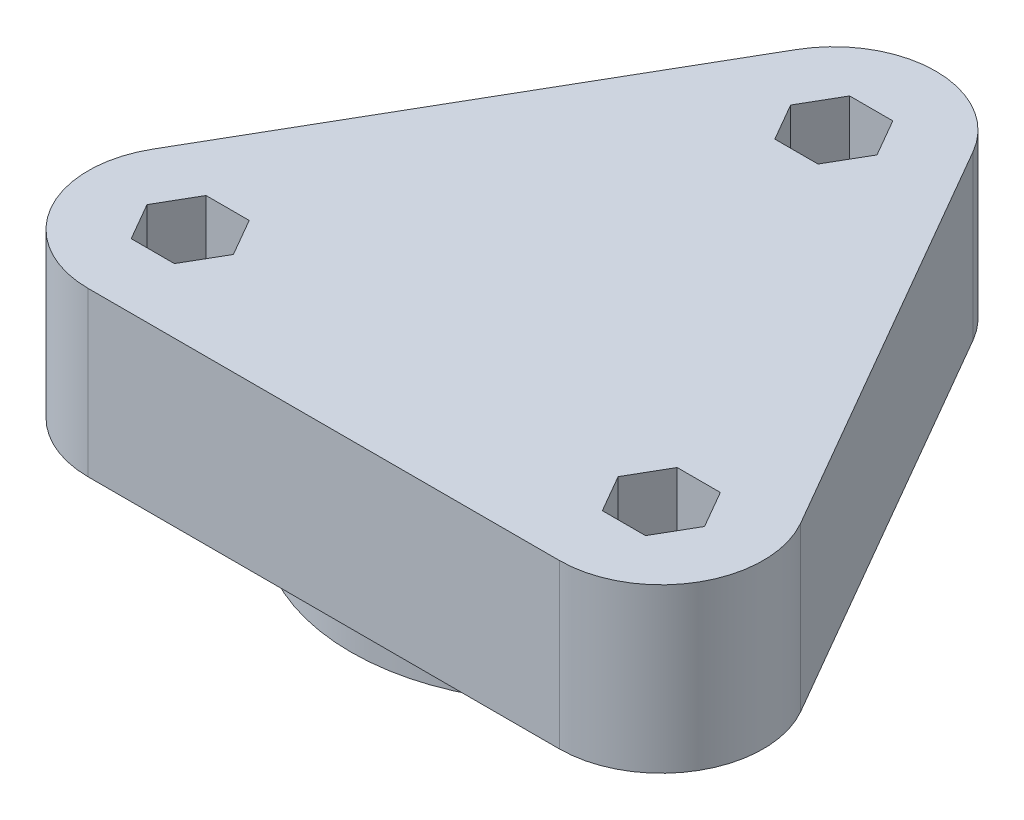
ISO-10303-21;
HEADER;
FILE_DESCRIPTION(('STEP AP214'),'2;1');
FILE_NAME('part.step','',(''),(''),'','','');
FILE_SCHEMA(('AUTOMOTIVE_DESIGN { 1 0 10303 214 1 1 1 1 }'));
ENDSEC;
DATA;
#1=APPLICATION_CONTEXT('core data for automotive mechanical design processes');
#2=APPLICATION_PROTOCOL_DEFINITION('international standard','automotive_design',2000,#1);
#3=PRODUCT_CONTEXT('',#1,'mechanical');
#4=PRODUCT('Part','Part','',(#3));
#5=PRODUCT_RELATED_PRODUCT_CATEGORY('part','',(#4));
#6=PRODUCT_DEFINITION_FORMATION('','',#4);
#7=PRODUCT_DEFINITION_CONTEXT('part definition',#1,'design');
#8=PRODUCT_DEFINITION('design','',#6,#7);
#9=PRODUCT_DEFINITION_SHAPE('','',#8);
#10=(LENGTH_UNIT() NAMED_UNIT(*) SI_UNIT(.MILLI.,.METRE.));
#11=(NAMED_UNIT(*) PLANE_ANGLE_UNIT() SI_UNIT($,.RADIAN.));
#12=(NAMED_UNIT(*) SI_UNIT($,.STERADIAN.) SOLID_ANGLE_UNIT());
#13=UNCERTAINTY_MEASURE_WITH_UNIT(LENGTH_MEASURE(1.E-05),#10,'distance_accuracy_value','');
#14=(GEOMETRIC_REPRESENTATION_CONTEXT(3) GLOBAL_UNCERTAINTY_ASSIGNED_CONTEXT((#13)) GLOBAL_UNIT_ASSIGNED_CONTEXT((#10,
#11,#12)) REPRESENTATION_CONTEXT('',''));
#15=CARTESIAN_POINT('',(0.,0.,0.));
#16=DIRECTION('',(0.,0.,1.));
#17=DIRECTION('',(1.,0.,0.));
#18=AXIS2_PLACEMENT_3D('',#15,#16,#17);
#19=CARTESIAN_POINT('',(0.,0.,-20.));
#20=DIRECTION('',(0.,1.,0.));
#21=DIRECTION('',(0.,0.,1.));
#22=AXIS2_PLACEMENT_3D('',#19,#20,#21);
#23=PLANE('',#22);
#24=CARTESIAN_POINT('',(17.3205080756887,0.,10.0000000000001));
#25=DIRECTION('',(0.,1.,0.));
#26=DIRECTION('',(0.,0.,1.));
#27=AXIS2_PLACEMENT_3D('',#24,#25,#26);
#28=CIRCLE('',#27,1.6);
#29=CARTESIAN_POINT('',(17.3205080756887,0.,11.6000000000001));
#30=VERTEX_POINT('',#29);
#31=EDGE_CURVE('E347',#30,#30,#28,.T.);
#32=ORIENTED_EDGE('',*,*,#31,.T.);
#33=EDGE_LOOP('',(#32));
#34=FACE_BOUND('',#33,.T.);
#35=CARTESIAN_POINT('',(-17.3205080756887,0.,10.0000000000001));
#36=DIRECTION('',(0.,1.,0.));
#37=DIRECTION('',(0.,0.,1.));
#38=AXIS2_PLACEMENT_3D('',#35,#36,#37);
#39=CIRCLE('',#38,1.6);
#40=CARTESIAN_POINT('',(-17.3205080756887,0.,11.6000000000001));
#41=VERTEX_POINT('',#40);
#42=EDGE_CURVE('E350',#41,#41,#39,.T.);
#43=ORIENTED_EDGE('',*,*,#42,.T.);
#44=EDGE_LOOP('',(#43));
#45=FACE_BOUND('',#44,.T.);
#46=CARTESIAN_POINT('',(0.,0.,-20.));
#47=DIRECTION('',(0.,1.,0.));
#48=DIRECTION('',(0.,0.,1.));
#49=AXIS2_PLACEMENT_3D('',#46,#47,#48);
#50=CIRCLE('',#49,1.6);
#51=CARTESIAN_POINT('',(0.,0.,-18.4));
#52=VERTEX_POINT('',#51);
#53=EDGE_CURVE('E353',#52,#52,#50,.T.);
#54=ORIENTED_EDGE('',*,*,#53,.T.);
#55=EDGE_LOOP('',(#54));
#56=FACE_BOUND('',#55,.T.);
#57=CARTESIAN_POINT('',(0.,0.,-20.));
#58=DIRECTION('',(0.,1.,0.));
#59=DIRECTION('',(0.,0.,1.));
#60=AXIS2_PLACEMENT_3D('',#57,#58,#59);
#61=CIRCLE('',#60,7.49999999999992);
#62=CARTESIAN_POINT('',(6.49519052838323,0.,-23.7499999999999));
#63=VERTEX_POINT('',#62);
#64=CARTESIAN_POINT('',(-6.49519052838323,0.,-23.7499999999999));
#65=VERTEX_POINT('',#64);
#66=EDGE_CURVE('E356',#63,#65,#61,.T.);
#67=ORIENTED_EDGE('',*,*,#66,.F.);
#68=DIRECTION('',(-0.499999999999998,0.,-0.86602540378444));
#69=VECTOR('',#68,1.);
#70=CARTESIAN_POINT('',(6.49519052838323,0.,-23.7499999999999));
#71=LINE('',#70,#69);
#72=CARTESIAN_POINT('',(23.815698604072,0.,6.25000000000013));
#73=VERTEX_POINT('',#72);
#74=EDGE_CURVE('E361',#73,#63,#71,.T.);
#75=ORIENTED_EDGE('',*,*,#74,.F.);
#76=CARTESIAN_POINT('',(17.3205080756887,0.,10.0000000000001));
#77=DIRECTION('',(0.,1.,0.));
#78=DIRECTION('',(0.,0.,1.));
#79=AXIS2_PLACEMENT_3D('',#76,#77,#78);
#80=CIRCLE('',#79,7.49999999999993);
#81=CARTESIAN_POINT('',(17.3205080756887,0.,17.5));
#82=VERTEX_POINT('',#81);
#83=EDGE_CURVE('E380',#82,#73,#80,.T.);
#84=ORIENTED_EDGE('',*,*,#83,.F.);
#85=DIRECTION('',(1.,0.,0.));
#86=VECTOR('',#85,1.);
#87=CARTESIAN_POINT('',(-17.3205080756887,0.,17.5));
#88=LINE('',#87,#86);
#89=CARTESIAN_POINT('',(-17.3205080756887,0.,17.5));
#90=VERTEX_POINT('',#89);
#91=EDGE_CURVE('E378',#90,#82,#88,.T.);
#92=ORIENTED_EDGE('',*,*,#91,.F.);
#93=CARTESIAN_POINT('',(-17.3205080756887,0.,10.0000000000001));
#94=DIRECTION('',(0.,1.,0.));
#95=DIRECTION('',(0.,0.,1.));
#96=AXIS2_PLACEMENT_3D('',#93,#94,#95);
#97=CIRCLE('',#96,7.49999999999993);
#98=CARTESIAN_POINT('',(-23.815698604072,0.,6.25000000000013));
#99=VERTEX_POINT('',#98);
#100=EDGE_CURVE('E376',#99,#90,#97,.T.);
#101=ORIENTED_EDGE('',*,*,#100,.F.);
#102=DIRECTION('',(-0.499999999999998,0.,0.86602540378444));
#103=VECTOR('',#102,1.);
#104=CARTESIAN_POINT('',(-6.49519052838323,0.,-23.7499999999999));
#105=LINE('',#104,#103);
#106=EDGE_CURVE('E374',#65,#99,#105,.T.);
#107=ORIENTED_EDGE('',*,*,#106,.F.);
#108=EDGE_LOOP('',(#67,#75,#84,#92,#101,#107));
#109=FACE_BOUND('',#108,.T.);
#110=CARTESIAN_POINT('',(0.,0.,0.));
#111=DIRECTION('',(0.,1.,0.));
#112=DIRECTION('',(0.,0.,1.));
#113=AXIS2_PLACEMENT_3D('',#110,#111,#112);
#114=CIRCLE('',#113,15.5);
#115=CARTESIAN_POINT('',(0.,0.,15.5));
#116=VERTEX_POINT('',#115);
#117=EDGE_CURVE('E11',#116,#116,#114,.F.);
#118=ORIENTED_EDGE('',*,*,#117,.F.);
#119=EDGE_LOOP('',(#118));
#120=FACE_BOUND('',#119,.T.);
#121=ADVANCED_FACE('F32',(#34,#45,#56,#109,#120),#23,.F.);
#122=CARTESIAN_POINT('',(17.3205080756887,12.,10.0000000000001));
#123=DIRECTION('',(0.,-1.,0.));
#124=DIRECTION('',(0.,0.,-1.));
#125=AXIS2_PLACEMENT_3D('',#122,#123,#124);
#126=CYLINDRICAL_SURFACE('',#125,1.6);
#127=ORIENTED_EDGE('',*,*,#31,.F.);
#128=EDGE_LOOP('',(#127));
#129=FACE_BOUND('',#128,.T.);
#130=CARTESIAN_POINT('',(17.3205080756887,7.,10.0000000000001));
#131=DIRECTION('',(0.,1.,0.));
#132=DIRECTION('',(0.,0.,1.));
#133=AXIS2_PLACEMENT_3D('',#130,#131,#132);
#134=CIRCLE('',#133,1.6);
#135=CARTESIAN_POINT('',(17.3205080756887,7.,11.6000000000001));
#136=VERTEX_POINT('',#135);
#137=EDGE_CURVE('E243',#136,#136,#134,.T.);
#138=ORIENTED_EDGE('',*,*,#137,.T.);
#139=EDGE_LOOP('',(#138));
#140=FACE_BOUND('',#139,.T.);
#141=ADVANCED_FACE('F405',(#129,#140),#126,.F.);
#142=CARTESIAN_POINT('',(0.,12.,-20.));
#143=DIRECTION('',(0.,-1.,0.));
#144=DIRECTION('',(0.,0.,-1.));
#145=AXIS2_PLACEMENT_3D('',#142,#143,#144);
#146=CYLINDRICAL_SURFACE('',#145,1.6);
#147=ORIENTED_EDGE('',*,*,#53,.F.);
#148=EDGE_LOOP('',(#147));
#149=FACE_BOUND('',#148,.T.);
#150=CARTESIAN_POINT('',(0.,7.,-20.));
#151=DIRECTION('',(0.,1.,0.));
#152=DIRECTION('',(0.,0.,1.));
#153=AXIS2_PLACEMENT_3D('',#150,#151,#152);
#154=CIRCLE('',#153,1.6);
#155=CARTESIAN_POINT('',(0.,7.,-18.4));
#156=VERTEX_POINT('',#155);
#157=EDGE_CURVE('E288',#156,#156,#154,.T.);
#158=ORIENTED_EDGE('',*,*,#157,.T.);
#159=EDGE_LOOP('',(#158));
#160=FACE_BOUND('',#159,.T.);
#161=ADVANCED_FACE('F427',(#149,#160),#146,.F.);
#162=CARTESIAN_POINT('',(-17.3205080756887,12.,10.0000000000001));
#163=DIRECTION('',(0.,-1.,0.));
#164=DIRECTION('',(0.,0.,-1.));
#165=AXIS2_PLACEMENT_3D('',#162,#163,#164);
#166=CYLINDRICAL_SURFACE('',#165,1.6);
#167=ORIENTED_EDGE('',*,*,#42,.F.);
#168=EDGE_LOOP('',(#167));
#169=FACE_BOUND('',#168,.T.);
#170=CARTESIAN_POINT('',(-17.3205080756887,7.,10.0000000000001));
#171=DIRECTION('',(0.,1.,0.));
#172=DIRECTION('',(0.,0.,1.));
#173=AXIS2_PLACEMENT_3D('',#170,#171,#172);
#174=CIRCLE('',#173,1.6);
#175=CARTESIAN_POINT('',(-17.3205080756887,7.,11.6000000000001));
#176=VERTEX_POINT('',#175);
#177=EDGE_CURVE('E336',#176,#176,#174,.T.);
#178=ORIENTED_EDGE('',*,*,#177,.T.);
#179=EDGE_LOOP('',(#178));
#180=FACE_BOUND('',#179,.T.);
#181=ADVANCED_FACE('F478',(#169,#180),#166,.F.);
#182=CARTESIAN_POINT('',(0.,12.,-20.));
#183=DIRECTION('',(0.,1.,0.));
#184=DIRECTION('',(0.,0.,1.));
#185=AXIS2_PLACEMENT_3D('',#182,#183,#184);
#186=PLANE('',#185);
#187=DIRECTION('',(-0.500000000000001,0.,-0.866025403784438));
#188=VECTOR('',#187,1.);
#189=CARTESIAN_POINT('',(20.4959345562317,12.,10.0000000000001));
#190=LINE('',#189,#188);
#191=CARTESIAN_POINT('',(20.4959345562317,12.,10.0000000000001));
#192=VERTEX_POINT('',#191);
#193=CARTESIAN_POINT('',(18.9082213159602,12.,7.25000000000007));
#194=VERTEX_POINT('',#193);
#195=EDGE_CURVE('E47',#192,#194,#190,.T.);
#196=ORIENTED_EDGE('',*,*,#195,.F.);
#197=DIRECTION('',(0.5,0.,-0.866025403784439));
#198=VECTOR('',#197,1.);
#199=CARTESIAN_POINT('',(18.9082213159602,12.,12.7500000000001));
#200=LINE('',#199,#198);
#201=CARTESIAN_POINT('',(18.9082213159602,12.,12.7500000000001));
#202=VERTEX_POINT('',#201);
#203=EDGE_CURVE('E214',#202,#192,#200,.T.);
#204=ORIENTED_EDGE('',*,*,#203,.F.);
#205=DIRECTION('',(1.,0.,0.));
#206=VECTOR('',#205,1.);
#207=CARTESIAN_POINT('',(15.7327948354173,12.,12.7500000000001));
#208=LINE('',#207,#206);
#209=CARTESIAN_POINT('',(15.7327948354173,12.,12.7500000000001));
#210=VERTEX_POINT('',#209);
#211=EDGE_CURVE('E217',#210,#202,#208,.T.);
#212=ORIENTED_EDGE('',*,*,#211,.F.);
#213=DIRECTION('',(0.500000000000001,0.,0.866025403784438));
#214=VECTOR('',#213,1.);
#215=CARTESIAN_POINT('',(14.1450815951458,12.,10.0000000000001));
#216=LINE('',#215,#214);
#217=CARTESIAN_POINT('',(14.1450815951458,12.,10.0000000000001));
#218=VERTEX_POINT('',#217);
#219=EDGE_CURVE('E236',#218,#210,#216,.T.);
#220=ORIENTED_EDGE('',*,*,#219,.F.);
#221=DIRECTION('',(-0.500000000000001,0.,0.866025403784438));
#222=VECTOR('',#221,1.);
#223=CARTESIAN_POINT('',(15.7327948354173,12.,7.25000000000008));
#224=LINE('',#223,#222);
#225=CARTESIAN_POINT('',(15.7327948354173,12.,7.25000000000008));
#226=VERTEX_POINT('',#225);
#227=EDGE_CURVE('E233',#226,#218,#224,.T.);
#228=ORIENTED_EDGE('',*,*,#227,.F.);
#229=DIRECTION('',(-1.,0.,0.));
#230=VECTOR('',#229,1.);
#231=CARTESIAN_POINT('',(18.9082213159602,12.,7.25000000000008));
#232=LINE('',#231,#230);
#233=EDGE_CURVE('E231',#194,#226,#232,.T.);
#234=ORIENTED_EDGE('',*,*,#233,.F.);
#235=EDGE_LOOP('',(#196,#204,#212,#220,#228,#234));
#236=FACE_BOUND('',#235,.T.);
#237=DIRECTION('',(-1.,0.,0.));
#238=VECTOR('',#237,1.);
#239=CARTESIAN_POINT('',(1.58771324027147,12.,-22.75));
#240=LINE('',#239,#238);
#241=CARTESIAN_POINT('',(1.58771324027147,12.,-22.75));
#242=VERTEX_POINT('',#241);
#243=CARTESIAN_POINT('',(-1.58771324027147,12.,-22.75));
#244=VERTEX_POINT('',#243);
#245=EDGE_CURVE('E55',#242,#244,#240,.T.);
#246=ORIENTED_EDGE('',*,*,#245,.F.);
#247=DIRECTION('',(-0.5,0.,-0.866025403784439));
#248=VECTOR('',#247,1.);
#249=CARTESIAN_POINT('',(3.17542648054294,12.,-20.));
#250=LINE('',#249,#248);
#251=CARTESIAN_POINT('',(3.17542648054294,12.,-20.));
#252=VERTEX_POINT('',#251);
#253=EDGE_CURVE('E255',#252,#242,#250,.T.);
#254=ORIENTED_EDGE('',*,*,#253,.F.);
#255=DIRECTION('',(0.5,0.,-0.866025403784439));
#256=VECTOR('',#255,1.);
#257=CARTESIAN_POINT('',(1.58771324027147,12.,-17.25));
#258=LINE('',#257,#256);
#259=CARTESIAN_POINT('',(1.58771324027147,12.,-17.25));
#260=VERTEX_POINT('',#259);
#261=EDGE_CURVE('E281',#260,#252,#258,.T.);
#262=ORIENTED_EDGE('',*,*,#261,.F.);
#263=DIRECTION('',(1.,0.,0.));
#264=VECTOR('',#263,1.);
#265=CARTESIAN_POINT('',(-1.58771324027147,12.,-17.25));
#266=LINE('',#265,#264);
#267=CARTESIAN_POINT('',(-1.58771324027147,12.,-17.25));
#268=VERTEX_POINT('',#267);
#269=EDGE_CURVE('E278',#268,#260,#266,.T.);
#270=ORIENTED_EDGE('',*,*,#269,.F.);
#271=DIRECTION('',(0.5,0.,0.866025403784439));
#272=VECTOR('',#271,1.);
#273=CARTESIAN_POINT('',(-3.17542648054294,12.,-20.));
#274=LINE('',#273,#272);
#275=CARTESIAN_POINT('',(-3.17542648054294,12.,-20.));
#276=VERTEX_POINT('',#275);
#277=EDGE_CURVE('E275',#276,#268,#274,.T.);
#278=ORIENTED_EDGE('',*,*,#277,.F.);
#279=DIRECTION('',(-0.499999999999999,0.,0.866025403784439));
#280=VECTOR('',#279,1.);
#281=CARTESIAN_POINT('',(-1.58771324027147,12.,-22.75));
#282=LINE('',#281,#280);
#283=EDGE_CURVE('E272',#244,#276,#282,.T.);
#284=ORIENTED_EDGE('',*,*,#283,.F.);
#285=EDGE_LOOP('',(#246,#254,#262,#270,#278,#284));
#286=FACE_BOUND('',#285,.T.);
#287=DIRECTION('',(-1.,0.,0.));
#288=VECTOR('',#287,1.);
#289=CARTESIAN_POINT('',(-15.7327948354173,12.,7.25000000000008));
#290=LINE('',#289,#288);
#291=CARTESIAN_POINT('',(-15.7327948354173,12.,7.25000000000008));
#292=VERTEX_POINT('',#291);
#293=CARTESIAN_POINT('',(-18.9082213159602,12.,7.25000000000008));
#294=VERTEX_POINT('',#293);
#295=EDGE_CURVE('E318',#292,#294,#290,.T.);
#296=ORIENTED_EDGE('',*,*,#295,.F.);
#297=DIRECTION('',(-0.5,0.,-0.866025403784439));
#298=VECTOR('',#297,1.);
#299=CARTESIAN_POINT('',(-14.1450815951458,12.,10.0000000000001));
#300=LINE('',#299,#298);
#301=CARTESIAN_POINT('',(-14.1450815951458,12.,10.0000000000001));
#302=VERTEX_POINT('',#301);
#303=EDGE_CURVE('E302',#302,#292,#300,.T.);
#304=ORIENTED_EDGE('',*,*,#303,.F.);
#305=DIRECTION('',(0.5,0.,-0.866025403784439));
#306=VECTOR('',#305,1.);
#307=CARTESIAN_POINT('',(-15.7327948354173,12.,12.7500000000001));
#308=LINE('',#307,#306);
#309=CARTESIAN_POINT('',(-15.7327948354173,12.,12.7500000000001));
#310=VERTEX_POINT('',#309);
#311=EDGE_CURVE('E329',#310,#302,#308,.T.);
#312=ORIENTED_EDGE('',*,*,#311,.F.);
#313=DIRECTION('',(1.,0.,0.));
#314=VECTOR('',#313,1.);
#315=CARTESIAN_POINT('',(-18.9082213159602,12.,12.7500000000001));
#316=LINE('',#315,#314);
#317=CARTESIAN_POINT('',(-18.9082213159602,12.,12.7500000000001));
#318=VERTEX_POINT('',#317);
#319=EDGE_CURVE('E326',#318,#310,#316,.T.);
#320=ORIENTED_EDGE('',*,*,#319,.F.);
#321=DIRECTION('',(0.5,0.,0.866025403784439));
#322=VECTOR('',#321,1.);
#323=CARTESIAN_POINT('',(-20.4959345562317,12.,10.0000000000001));
#324=LINE('',#323,#322);
#325=CARTESIAN_POINT('',(-20.4959345562317,12.,10.0000000000001));
#326=VERTEX_POINT('',#325);
#327=EDGE_CURVE('E323',#326,#318,#324,.T.);
#328=ORIENTED_EDGE('',*,*,#327,.F.);
#329=DIRECTION('',(-0.5,0.,0.866025403784439));
#330=VECTOR('',#329,1.);
#331=CARTESIAN_POINT('',(-18.9082213159602,12.,7.25000000000008));
#332=LINE('',#331,#330);
#333=EDGE_CURVE('E320',#294,#326,#332,.T.);
#334=ORIENTED_EDGE('',*,*,#333,.F.);
#335=EDGE_LOOP('',(#296,#304,#312,#320,#328,#334));
#336=FACE_BOUND('',#335,.T.);
#337=CARTESIAN_POINT('',(0.,12.,-20.));
#338=DIRECTION('',(0.,1.,0.));
#339=DIRECTION('',(0.,0.,1.));
#340=AXIS2_PLACEMENT_3D('',#337,#338,#339);
#341=CIRCLE('',#340,7.49999999999992);
#342=CARTESIAN_POINT('',(6.49519052838323,12.,-23.7499999999999));
#343=VERTEX_POINT('',#342);
#344=CARTESIAN_POINT('',(-6.49519052838323,12.,-23.7499999999999));
#345=VERTEX_POINT('',#344);
#346=EDGE_CURVE('E357',#343,#345,#341,.T.);
#347=ORIENTED_EDGE('',*,*,#346,.T.);
#348=DIRECTION('',(-0.499999999999998,0.,0.86602540378444));
#349=VECTOR('',#348,1.);
#350=CARTESIAN_POINT('',(-6.49519052838323,12.,-23.7499999999999));
#351=LINE('',#350,#349);
#352=CARTESIAN_POINT('',(-23.815698604072,12.,6.25000000000013));
#353=VERTEX_POINT('',#352);
#354=EDGE_CURVE('E360',#345,#353,#351,.T.);
#355=ORIENTED_EDGE('',*,*,#354,.T.);
#356=CARTESIAN_POINT('',(-17.3205080756887,12.,10.0000000000001));
#357=DIRECTION('',(0.,1.,0.));
#358=DIRECTION('',(0.,0.,1.));
#359=AXIS2_PLACEMENT_3D('',#356,#357,#358);
#360=CIRCLE('',#359,7.49999999999993);
#361=CARTESIAN_POINT('',(-17.3205080756887,12.,17.5));
#362=VERTEX_POINT('',#361);
#363=EDGE_CURVE('E363',#353,#362,#360,.T.);
#364=ORIENTED_EDGE('',*,*,#363,.T.);
#365=DIRECTION('',(1.,0.,0.));
#366=VECTOR('',#365,1.);
#367=CARTESIAN_POINT('',(-17.3205080756887,12.,17.5));
#368=LINE('',#367,#366);
#369=CARTESIAN_POINT('',(17.3205080756887,12.,17.5));
#370=VERTEX_POINT('',#369);
#371=EDGE_CURVE('E365',#362,#370,#368,.T.);
#372=ORIENTED_EDGE('',*,*,#371,.T.);
#373=CARTESIAN_POINT('',(17.3205080756887,12.,10.0000000000001));
#374=DIRECTION('',(0.,1.,0.));
#375=DIRECTION('',(0.,0.,1.));
#376=AXIS2_PLACEMENT_3D('',#373,#374,#375);
#377=CIRCLE('',#376,7.49999999999993);
#378=CARTESIAN_POINT('',(23.815698604072,12.,6.25000000000013));
#379=VERTEX_POINT('',#378);
#380=EDGE_CURVE('E367',#370,#379,#377,.T.);
#381=ORIENTED_EDGE('',*,*,#380,.T.);
#382=DIRECTION('',(-0.499999999999998,0.,-0.86602540378444));
#383=VECTOR('',#382,1.);
#384=CARTESIAN_POINT('',(6.49519052838323,12.,-23.7499999999999));
#385=LINE('',#384,#383);
#386=EDGE_CURVE('E369',#379,#343,#385,.T.);
#387=ORIENTED_EDGE('',*,*,#386,.T.);
#388=EDGE_LOOP('',(#347,#355,#364,#372,#381,#387));
#389=FACE_BOUND('',#388,.T.);
#390=ADVANCED_FACE('F433',(#236,#286,#336,#389),#186,.T.);
#391=CARTESIAN_POINT('',(0.,12.,-20.));
#392=DIRECTION('',(0.,-1.,0.));
#393=DIRECTION('',(0.,0.,-1.));
#394=AXIS2_PLACEMENT_3D('',#391,#392,#393);
#395=CYLINDRICAL_SURFACE('',#394,7.49999999999992);
#396=ORIENTED_EDGE('',*,*,#66,.T.);
#397=DIRECTION('',(0.,-1.,0.));
#398=VECTOR('',#397,1.);
#399=CARTESIAN_POINT('',(-6.49519052838323,12.,-23.7499999999999));
#400=LINE('',#399,#398);
#401=EDGE_CURVE('E40',#345,#65,#400,.T.);
#402=ORIENTED_EDGE('',*,*,#401,.F.);
#403=ORIENTED_EDGE('',*,*,#346,.F.);
#404=DIRECTION('',(0.,-1.,0.));
#405=VECTOR('',#404,1.);
#406=CARTESIAN_POINT('',(6.49519052838323,12.,-23.7499999999999));
#407=LINE('',#406,#405);
#408=EDGE_CURVE('E371',#343,#63,#407,.T.);
#409=ORIENTED_EDGE('',*,*,#408,.T.);
#410=EDGE_LOOP('',(#396,#402,#403,#409));
#411=FACE_BOUND('',#410,.T.);
#412=ADVANCED_FACE('F34',(#411),#395,.T.);
#413=CARTESIAN_POINT('',(-6.49519052838323,12.,-23.7499999999999));
#414=DIRECTION('',(0.86602540378444,0.,0.499999999999998));
#415=DIRECTION('',(0.499999999999998,0.,-0.86602540378444));
#416=AXIS2_PLACEMENT_3D('',#413,#414,#415);
#417=PLANE('',#416);
#418=ORIENTED_EDGE('',*,*,#106,.T.);
#419=DIRECTION('',(0.,-1.,0.));
#420=VECTOR('',#419,1.);
#421=CARTESIAN_POINT('',(-23.815698604072,12.,6.25000000000013));
#422=LINE('',#421,#420);
#423=EDGE_CURVE('E394',#353,#99,#422,.T.);
#424=ORIENTED_EDGE('',*,*,#423,.F.);
#425=ORIENTED_EDGE('',*,*,#354,.F.);
#426=ORIENTED_EDGE('',*,*,#401,.T.);
#427=EDGE_LOOP('',(#418,#424,#425,#426));
#428=FACE_BOUND('',#427,.T.);
#429=ADVANCED_FACE('F450',(#428),#417,.F.);
#430=CARTESIAN_POINT('',(-17.3205080756887,12.,10.0000000000001));
#431=DIRECTION('',(0.,-1.,0.));
#432=DIRECTION('',(0.,0.,-1.));
#433=AXIS2_PLACEMENT_3D('',#430,#431,#432);
#434=CYLINDRICAL_SURFACE('',#433,7.49999999999993);
#435=ORIENTED_EDGE('',*,*,#100,.T.);
#436=DIRECTION('',(0.,-1.,0.));
#437=VECTOR('',#436,1.);
#438=CARTESIAN_POINT('',(-17.3205080756887,12.,17.5));
#439=LINE('',#438,#437);
#440=EDGE_CURVE('E391',#362,#90,#439,.T.);
#441=ORIENTED_EDGE('',*,*,#440,.F.);
#442=ORIENTED_EDGE('',*,*,#363,.F.);
#443=ORIENTED_EDGE('',*,*,#423,.T.);
#444=EDGE_LOOP('',(#435,#441,#442,#443));
#445=FACE_BOUND('',#444,.T.);
#446=ADVANCED_FACE('F447',(#445),#434,.T.);
#447=CARTESIAN_POINT('',(-17.3205080756887,12.,17.5));
#448=DIRECTION('',(0.,0.,-1.));
#449=DIRECTION('',(-1.,0.,0.));
#450=AXIS2_PLACEMENT_3D('',#447,#448,#449);
#451=PLANE('',#450);
#452=ORIENTED_EDGE('',*,*,#91,.T.);
#453=DIRECTION('',(0.,-1.,0.));
#454=VECTOR('',#453,1.);
#455=CARTESIAN_POINT('',(17.3205080756887,12.,17.5));
#456=LINE('',#455,#454);
#457=EDGE_CURVE('E388',#370,#82,#456,.T.);
#458=ORIENTED_EDGE('',*,*,#457,.F.);
#459=ORIENTED_EDGE('',*,*,#371,.F.);
#460=ORIENTED_EDGE('',*,*,#440,.T.);
#461=EDGE_LOOP('',(#452,#458,#459,#460));
#462=FACE_BOUND('',#461,.T.);
#463=ADVANCED_FACE('F443',(#462),#451,.F.);
#464=CARTESIAN_POINT('',(17.3205080756887,12.,10.0000000000001));
#465=DIRECTION('',(0.,-1.,0.));
#466=DIRECTION('',(0.,0.,-1.));
#467=AXIS2_PLACEMENT_3D('',#464,#465,#466);
#468=CYLINDRICAL_SURFACE('',#467,7.49999999999993);
#469=ORIENTED_EDGE('',*,*,#83,.T.);
#470=DIRECTION('',(0.,-1.,0.));
#471=VECTOR('',#470,1.);
#472=CARTESIAN_POINT('',(23.815698604072,12.,6.25000000000013));
#473=LINE('',#472,#471);
#474=EDGE_CURVE('E385',#379,#73,#473,.T.);
#475=ORIENTED_EDGE('',*,*,#474,.F.);
#476=ORIENTED_EDGE('',*,*,#380,.F.);
#477=ORIENTED_EDGE('',*,*,#457,.T.);
#478=EDGE_LOOP('',(#469,#475,#476,#477));
#479=FACE_BOUND('',#478,.T.);
#480=ADVANCED_FACE('F439',(#479),#468,.T.);
#481=CARTESIAN_POINT('',(6.49519052838323,12.,-23.7499999999999));
#482=DIRECTION('',(-0.86602540378444,0.,0.499999999999998));
#483=DIRECTION('',(0.499999999999998,0.,0.86602540378444));
#484=AXIS2_PLACEMENT_3D('',#481,#482,#483);
#485=PLANE('',#484);
#486=ORIENTED_EDGE('',*,*,#74,.T.);
#487=ORIENTED_EDGE('',*,*,#408,.F.);
#488=ORIENTED_EDGE('',*,*,#386,.F.);
#489=ORIENTED_EDGE('',*,*,#474,.T.);
#490=EDGE_LOOP('',(#486,#487,#488,#489));
#491=FACE_BOUND('',#490,.T.);
#492=ADVANCED_FACE('F435',(#491),#485,.F.);
#493=CARTESIAN_POINT('',(-15.7327948354173,7.,7.25000000000008));
#494=DIRECTION('',(0.,0.,-1.));
#495=DIRECTION('',(-1.,0.,0.));
#496=AXIS2_PLACEMENT_3D('',#493,#494,#495);
#497=PLANE('',#496);
#498=ORIENTED_EDGE('',*,*,#295,.T.);
#499=DIRECTION('',(0.,1.,0.));
#500=VECTOR('',#499,1.);
#501=CARTESIAN_POINT('',(-18.9082213159602,7.,7.25000000000008));
#502=LINE('',#501,#500);
#503=CARTESIAN_POINT('',(-18.9082213159602,7.,7.25000000000008));
#504=VERTEX_POINT('',#503);
#505=EDGE_CURVE('E317',#504,#294,#502,.T.);
#506=ORIENTED_EDGE('',*,*,#505,.F.);
#507=DIRECTION('',(-1.,0.,0.));
#508=VECTOR('',#507,1.);
#509=CARTESIAN_POINT('',(-15.7327948354173,7.,7.25000000000008));
#510=LINE('',#509,#508);
#511=CARTESIAN_POINT('',(-15.7327948354173,7.,7.25000000000008));
#512=VERTEX_POINT('',#511);
#513=EDGE_CURVE('E298',#512,#504,#510,.T.);
#514=ORIENTED_EDGE('',*,*,#513,.F.);
#515=DIRECTION('',(0.,1.,0.));
#516=VECTOR('',#515,1.);
#517=CARTESIAN_POINT('',(-15.7327948354173,7.,7.25000000000008));
#518=LINE('',#517,#516);
#519=EDGE_CURVE('E334',#512,#292,#518,.T.);
#520=ORIENTED_EDGE('',*,*,#519,.T.);
#521=EDGE_LOOP('',(#498,#506,#514,#520));
#522=FACE_BOUND('',#521,.T.);
#523=ADVANCED_FACE('F438',(#522),#497,.F.);
#524=CARTESIAN_POINT('',(-14.1450815951458,7.,10.0000000000001));
#525=DIRECTION('',(0.866025403784439,0.,-0.5));
#526=DIRECTION('',(-0.5,0.,-0.866025403784439));
#527=AXIS2_PLACEMENT_3D('',#524,#525,#526);
#528=PLANE('',#527);
#529=ORIENTED_EDGE('',*,*,#303,.T.);
#530=ORIENTED_EDGE('',*,*,#519,.F.);
#531=DIRECTION('',(-0.5,0.,-0.866025403784439));
#532=VECTOR('',#531,1.);
#533=CARTESIAN_POINT('',(-14.1450815951458,7.,10.0000000000001));
#534=LINE('',#533,#532);
#535=CARTESIAN_POINT('',(-14.1450815951458,7.,10.0000000000001));
#536=VERTEX_POINT('',#535);
#537=EDGE_CURVE('E314',#536,#512,#534,.T.);
#538=ORIENTED_EDGE('',*,*,#537,.F.);
#539=DIRECTION('',(0.,1.,0.));
#540=VECTOR('',#539,1.);
#541=CARTESIAN_POINT('',(-14.1450815951458,7.,10.0000000000001));
#542=LINE('',#541,#540);
#543=EDGE_CURVE('E337',#536,#302,#542,.T.);
#544=ORIENTED_EDGE('',*,*,#543,.T.);
#545=EDGE_LOOP('',(#529,#530,#538,#544));
#546=FACE_BOUND('',#545,.T.);
#547=ADVANCED_FACE('F506',(#546),#528,.F.);
#548=CARTESIAN_POINT('',(-15.7327948354173,7.,12.7500000000001));
#549=DIRECTION('',(0.866025403784439,0.,0.5));
#550=DIRECTION('',(0.5,0.,-0.866025403784439));
#551=AXIS2_PLACEMENT_3D('',#548,#549,#550);
#552=PLANE('',#551);
#553=ORIENTED_EDGE('',*,*,#311,.T.);
#554=ORIENTED_EDGE('',*,*,#543,.F.);
#555=DIRECTION('',(0.5,0.,-0.866025403784439));
#556=VECTOR('',#555,1.);
#557=CARTESIAN_POINT('',(-15.7327948354173,7.,12.7500000000001));
#558=LINE('',#557,#556);
#559=CARTESIAN_POINT('',(-15.7327948354173,7.,12.7500000000001));
#560=VERTEX_POINT('',#559);
#561=EDGE_CURVE('E311',#560,#536,#558,.T.);
#562=ORIENTED_EDGE('',*,*,#561,.F.);
#563=DIRECTION('',(0.,1.,0.));
#564=VECTOR('',#563,1.);
#565=CARTESIAN_POINT('',(-15.7327948354173,7.,12.7500000000001));
#566=LINE('',#565,#564);
#567=EDGE_CURVE('E339',#560,#310,#566,.T.);
#568=ORIENTED_EDGE('',*,*,#567,.T.);
#569=EDGE_LOOP('',(#553,#554,#562,#568));
#570=FACE_BOUND('',#569,.T.);
#571=ADVANCED_FACE('F508',(#570),#552,.F.);
#572=CARTESIAN_POINT('',(-18.9082213159602,7.,12.7500000000001));
#573=DIRECTION('',(0.,0.,1.));
#574=DIRECTION('',(1.,0.,0.));
#575=AXIS2_PLACEMENT_3D('',#572,#573,#574);
#576=PLANE('',#575);
#577=ORIENTED_EDGE('',*,*,#319,.T.);
#578=ORIENTED_EDGE('',*,*,#567,.F.);
#579=DIRECTION('',(1.,0.,0.));
#580=VECTOR('',#579,1.);
#581=CARTESIAN_POINT('',(-18.9082213159602,7.,12.7500000000001));
#582=LINE('',#581,#580);
#583=CARTESIAN_POINT('',(-18.9082213159602,7.,12.7500000000001));
#584=VERTEX_POINT('',#583);
#585=EDGE_CURVE('E308',#584,#560,#582,.T.);
#586=ORIENTED_EDGE('',*,*,#585,.F.);
#587=DIRECTION('',(0.,1.,0.));
#588=VECTOR('',#587,1.);
#589=CARTESIAN_POINT('',(-18.9082213159602,7.,12.7500000000001));
#590=LINE('',#589,#588);
#591=EDGE_CURVE('E341',#584,#318,#590,.T.);
#592=ORIENTED_EDGE('',*,*,#591,.T.);
#593=EDGE_LOOP('',(#577,#578,#586,#592));
#594=FACE_BOUND('',#593,.T.);
#595=ADVANCED_FACE('F511',(#594),#576,.F.);
#596=CARTESIAN_POINT('',(-20.4959345562317,7.,10.0000000000001));
#597=DIRECTION('',(-0.866025403784439,0.,0.5));
#598=DIRECTION('',(0.5,0.,0.866025403784439));
#599=AXIS2_PLACEMENT_3D('',#596,#597,#598);
#600=PLANE('',#599);
#601=ORIENTED_EDGE('',*,*,#327,.T.);
#602=ORIENTED_EDGE('',*,*,#591,.F.);
#603=DIRECTION('',(0.5,0.,0.866025403784439));
#604=VECTOR('',#603,1.);
#605=CARTESIAN_POINT('',(-20.4959345562317,7.,10.0000000000001));
#606=LINE('',#605,#604);
#607=CARTESIAN_POINT('',(-20.4959345562317,7.,10.0000000000001));
#608=VERTEX_POINT('',#607);
#609=EDGE_CURVE('E305',#608,#584,#606,.T.);
#610=ORIENTED_EDGE('',*,*,#609,.F.);
#611=DIRECTION('',(0.,1.,0.));
#612=VECTOR('',#611,1.);
#613=CARTESIAN_POINT('',(-20.4959345562317,7.,10.0000000000001));
#614=LINE('',#613,#612);
#615=EDGE_CURVE('E343',#608,#326,#614,.T.);
#616=ORIENTED_EDGE('',*,*,#615,.T.);
#617=EDGE_LOOP('',(#601,#602,#610,#616));
#618=FACE_BOUND('',#617,.T.);
#619=ADVANCED_FACE('F514',(#618),#600,.F.);
#620=CARTESIAN_POINT('',(-18.9082213159602,7.,7.25000000000008));
#621=DIRECTION('',(-0.866025403784439,0.,-0.5));
#622=DIRECTION('',(-0.5,0.,0.866025403784439));
#623=AXIS2_PLACEMENT_3D('',#620,#621,#622);
#624=PLANE('',#623);
#625=ORIENTED_EDGE('',*,*,#333,.T.);
#626=ORIENTED_EDGE('',*,*,#615,.F.);
#627=DIRECTION('',(-0.5,0.,0.866025403784439));
#628=VECTOR('',#627,1.);
#629=CARTESIAN_POINT('',(-18.9082213159602,7.,7.25000000000008));
#630=LINE('',#629,#628);
#631=EDGE_CURVE('E301',#504,#608,#630,.T.);
#632=ORIENTED_EDGE('',*,*,#631,.F.);
#633=ORIENTED_EDGE('',*,*,#505,.T.);
#634=EDGE_LOOP('',(#625,#626,#632,#633));
#635=FACE_BOUND('',#634,.T.);
#636=ADVANCED_FACE('F499',(#635),#624,.F.);
#637=CARTESIAN_POINT('',(0.,7.,0.));
#638=DIRECTION('',(0.,1.,0.));
#639=DIRECTION('',(0.,0.,1.));
#640=AXIS2_PLACEMENT_3D('',#637,#638,#639);
#641=PLANE('',#640);
#642=ORIENTED_EDGE('',*,*,#177,.F.);
#643=EDGE_LOOP('',(#642));
#644=FACE_BOUND('',#643,.T.);
#645=ORIENTED_EDGE('',*,*,#513,.T.);
#646=ORIENTED_EDGE('',*,*,#631,.T.);
#647=ORIENTED_EDGE('',*,*,#609,.T.);
#648=ORIENTED_EDGE('',*,*,#585,.T.);
#649=ORIENTED_EDGE('',*,*,#561,.T.);
#650=ORIENTED_EDGE('',*,*,#537,.T.);
#651=EDGE_LOOP('',(#645,#646,#647,#648,#649,#650));
#652=FACE_BOUND('',#651,.T.);
#653=ADVANCED_FACE('F502',(#644,#652),#641,.T.);
#654=CARTESIAN_POINT('',(1.58771324027147,7.,-22.75));
#655=DIRECTION('',(0.,0.,-1.));
#656=DIRECTION('',(-1.,0.,0.));
#657=AXIS2_PLACEMENT_3D('',#654,#655,#656);
#658=PLANE('',#657);
#659=ORIENTED_EDGE('',*,*,#245,.T.);
#660=DIRECTION('',(0.,1.,0.));
#661=VECTOR('',#660,1.);
#662=CARTESIAN_POINT('',(-1.58771324027147,7.,-22.75));
#663=LINE('',#662,#661);
#664=CARTESIAN_POINT('',(-1.58771324027147,7.,-22.75));
#665=VERTEX_POINT('',#664);
#666=EDGE_CURVE('E270',#665,#244,#663,.T.);
#667=ORIENTED_EDGE('',*,*,#666,.F.);
#668=DIRECTION('',(-1.,0.,0.));
#669=VECTOR('',#668,1.);
#670=CARTESIAN_POINT('',(1.58771324027147,7.,-22.75));
#671=LINE('',#670,#669);
#672=CARTESIAN_POINT('',(1.58771324027147,7.,-22.75));
#673=VERTEX_POINT('',#672);
#674=EDGE_CURVE('E251',#673,#665,#671,.T.);
#675=ORIENTED_EDGE('',*,*,#674,.F.);
#676=DIRECTION('',(0.,1.,0.));
#677=VECTOR('',#676,1.);
#678=CARTESIAN_POINT('',(1.58771324027147,7.,-22.75));
#679=LINE('',#678,#677);
#680=EDGE_CURVE('E286',#673,#242,#679,.T.);
#681=ORIENTED_EDGE('',*,*,#680,.T.);
#682=EDGE_LOOP('',(#659,#667,#675,#681));
#683=FACE_BOUND('',#682,.T.);
#684=ADVANCED_FACE('F675',(#683),#658,.F.);
#685=CARTESIAN_POINT('',(3.17542648054294,7.,-20.));
#686=DIRECTION('',(0.866025403784439,0.,-0.5));
#687=DIRECTION('',(-0.5,0.,-0.866025403784439));
#688=AXIS2_PLACEMENT_3D('',#685,#686,#687);
#689=PLANE('',#688);
#690=ORIENTED_EDGE('',*,*,#253,.T.);
#691=ORIENTED_EDGE('',*,*,#680,.F.);
#692=DIRECTION('',(-0.5,0.,-0.866025403784439));
#693=VECTOR('',#692,1.);
#694=CARTESIAN_POINT('',(3.17542648054294,7.,-20.));
#695=LINE('',#694,#693);
#696=CARTESIAN_POINT('',(3.17542648054294,7.,-20.));
#697=VERTEX_POINT('',#696);
#698=EDGE_CURVE('E267',#697,#673,#695,.T.);
#699=ORIENTED_EDGE('',*,*,#698,.F.);
#700=DIRECTION('',(0.,1.,0.));
#701=VECTOR('',#700,1.);
#702=CARTESIAN_POINT('',(3.17542648054294,7.,-20.));
#703=LINE('',#702,#701);
#704=EDGE_CURVE('E289',#697,#252,#703,.T.);
#705=ORIENTED_EDGE('',*,*,#704,.T.);
#706=EDGE_LOOP('',(#690,#691,#699,#705));
#707=FACE_BOUND('',#706,.T.);
#708=ADVANCED_FACE('F684',(#707),#689,.F.);
#709=CARTESIAN_POINT('',(1.58771324027147,7.,-17.25));
#710=DIRECTION('',(0.866025403784439,0.,0.5));
#711=DIRECTION('',(0.5,0.,-0.866025403784439));
#712=AXIS2_PLACEMENT_3D('',#709,#710,#711);
#713=PLANE('',#712);
#714=ORIENTED_EDGE('',*,*,#261,.T.);
#715=ORIENTED_EDGE('',*,*,#704,.F.);
#716=DIRECTION('',(0.5,0.,-0.866025403784439));
#717=VECTOR('',#716,1.);
#718=CARTESIAN_POINT('',(1.58771324027147,7.,-17.25));
#719=LINE('',#718,#717);
#720=CARTESIAN_POINT('',(1.58771324027147,7.,-17.25));
#721=VERTEX_POINT('',#720);
#722=EDGE_CURVE('E264',#721,#697,#719,.T.);
#723=ORIENTED_EDGE('',*,*,#722,.F.);
#724=DIRECTION('',(0.,1.,0.));
#725=VECTOR('',#724,1.);
#726=CARTESIAN_POINT('',(1.58771324027147,7.,-17.25));
#727=LINE('',#726,#725);
#728=EDGE_CURVE('E291',#721,#260,#727,.T.);
#729=ORIENTED_EDGE('',*,*,#728,.T.);
#730=EDGE_LOOP('',(#714,#715,#723,#729));
#731=FACE_BOUND('',#730,.T.);
#732=ADVANCED_FACE('F692',(#731),#713,.F.);
#733=CARTESIAN_POINT('',(-1.58771324027147,7.,-17.25));
#734=DIRECTION('',(0.,0.,1.));
#735=DIRECTION('',(1.,0.,0.));
#736=AXIS2_PLACEMENT_3D('',#733,#734,#735);
#737=PLANE('',#736);
#738=ORIENTED_EDGE('',*,*,#269,.T.);
#739=ORIENTED_EDGE('',*,*,#728,.F.);
#740=DIRECTION('',(1.,0.,0.));
#741=VECTOR('',#740,1.);
#742=CARTESIAN_POINT('',(-1.58771324027147,7.,-17.25));
#743=LINE('',#742,#741);
#744=CARTESIAN_POINT('',(-1.58771324027147,7.,-17.25));
#745=VERTEX_POINT('',#744);
#746=EDGE_CURVE('E261',#745,#721,#743,.T.);
#747=ORIENTED_EDGE('',*,*,#746,.F.);
#748=DIRECTION('',(0.,1.,0.));
#749=VECTOR('',#748,1.);
#750=CARTESIAN_POINT('',(-1.58771324027147,7.,-17.25));
#751=LINE('',#750,#749);
#752=EDGE_CURVE('E293',#745,#268,#751,.T.);
#753=ORIENTED_EDGE('',*,*,#752,.T.);
#754=EDGE_LOOP('',(#738,#739,#747,#753));
#755=FACE_BOUND('',#754,.T.);
#756=ADVANCED_FACE('F701',(#755),#737,.F.);
#757=CARTESIAN_POINT('',(-3.17542648054294,7.,-20.));
#758=DIRECTION('',(-0.866025403784438,0.,0.5));
#759=DIRECTION('',(0.5,0.,0.866025403784439));
#760=AXIS2_PLACEMENT_3D('',#757,#758,#759);
#761=PLANE('',#760);
#762=ORIENTED_EDGE('',*,*,#277,.T.);
#763=ORIENTED_EDGE('',*,*,#752,.F.);
#764=DIRECTION('',(0.5,0.,0.866025403784439));
#765=VECTOR('',#764,1.);
#766=CARTESIAN_POINT('',(-3.17542648054294,7.,-20.));
#767=LINE('',#766,#765);
#768=CARTESIAN_POINT('',(-3.17542648054294,7.,-20.));
#769=VERTEX_POINT('',#768);
#770=EDGE_CURVE('E258',#769,#745,#767,.T.);
#771=ORIENTED_EDGE('',*,*,#770,.F.);
#772=DIRECTION('',(0.,1.,0.));
#773=VECTOR('',#772,1.);
#774=CARTESIAN_POINT('',(-3.17542648054294,7.,-20.));
#775=LINE('',#774,#773);
#776=EDGE_CURVE('E295',#769,#276,#775,.T.);
#777=ORIENTED_EDGE('',*,*,#776,.T.);
#778=EDGE_LOOP('',(#762,#763,#771,#777));
#779=FACE_BOUND('',#778,.T.);
#780=ADVANCED_FACE('F710',(#779),#761,.F.);
#781=CARTESIAN_POINT('',(-1.58771324027147,7.,-22.75));
#782=DIRECTION('',(-0.866025403784439,0.,-0.499999999999999));
#783=DIRECTION('',(-0.499999999999999,0.,0.866025403784439));
#784=AXIS2_PLACEMENT_3D('',#781,#782,#783);
#785=PLANE('',#784);
#786=ORIENTED_EDGE('',*,*,#283,.T.);
#787=ORIENTED_EDGE('',*,*,#776,.F.);
#788=DIRECTION('',(-0.499999999999999,0.,0.866025403784439));
#789=VECTOR('',#788,1.);
#790=CARTESIAN_POINT('',(-1.58771324027147,7.,-22.75));
#791=LINE('',#790,#789);
#792=EDGE_CURVE('E254',#665,#769,#791,.T.);
#793=ORIENTED_EDGE('',*,*,#792,.F.);
#794=ORIENTED_EDGE('',*,*,#666,.T.);
#795=EDGE_LOOP('',(#786,#787,#793,#794));
#796=FACE_BOUND('',#795,.T.);
#797=ADVANCED_FACE('F719',(#796),#785,.F.);
#798=CARTESIAN_POINT('',(0.,7.,0.));
#799=DIRECTION('',(0.,1.,0.));
#800=DIRECTION('',(0.,0.,1.));
#801=AXIS2_PLACEMENT_3D('',#798,#799,#800);
#802=PLANE('',#801);
#803=ORIENTED_EDGE('',*,*,#157,.F.);
#804=EDGE_LOOP('',(#803));
#805=FACE_BOUND('',#804,.T.);
#806=ORIENTED_EDGE('',*,*,#674,.T.);
#807=ORIENTED_EDGE('',*,*,#792,.T.);
#808=ORIENTED_EDGE('',*,*,#770,.T.);
#809=ORIENTED_EDGE('',*,*,#746,.T.);
#810=ORIENTED_EDGE('',*,*,#722,.T.);
#811=ORIENTED_EDGE('',*,*,#698,.T.);
#812=EDGE_LOOP('',(#806,#807,#808,#809,#810,#811));
#813=FACE_BOUND('',#812,.T.);
#814=ADVANCED_FACE('F728',(#805,#813),#802,.T.);
#815=CARTESIAN_POINT('',(20.4959345562317,7.,10.0000000000001));
#816=DIRECTION('',(0.866025403784438,0.,-0.500000000000001));
#817=DIRECTION('',(-0.500000000000001,0.,-0.866025403784438));
#818=AXIS2_PLACEMENT_3D('',#815,#816,#817);
#819=PLANE('',#818);
#820=ORIENTED_EDGE('',*,*,#195,.T.);
#821=DIRECTION('',(0.,1.,0.));
#822=VECTOR('',#821,1.);
#823=CARTESIAN_POINT('',(18.9082213159602,7.,7.25000000000008));
#824=LINE('',#823,#822);
#825=CARTESIAN_POINT('',(18.9082213159602,7.,7.25000000000008));
#826=VERTEX_POINT('',#825);
#827=EDGE_CURVE('E191',#826,#194,#824,.T.);
#828=ORIENTED_EDGE('',*,*,#827,.F.);
#829=DIRECTION('',(-0.500000000000001,0.,-0.866025403784438));
#830=VECTOR('',#829,1.);
#831=CARTESIAN_POINT('',(20.4959345562317,7.,10.0000000000001));
#832=LINE('',#831,#830);
#833=CARTESIAN_POINT('',(20.4959345562317,7.,10.0000000000001));
#834=VERTEX_POINT('',#833);
#835=EDGE_CURVE('E195',#834,#826,#832,.T.);
#836=ORIENTED_EDGE('',*,*,#835,.F.);
#837=DIRECTION('',(0.,1.,0.));
#838=VECTOR('',#837,1.);
#839=CARTESIAN_POINT('',(20.4959345562317,7.,10.0000000000001));
#840=LINE('',#839,#838);
#841=EDGE_CURVE('E241',#834,#192,#840,.T.);
#842=ORIENTED_EDGE('',*,*,#841,.T.);
#843=EDGE_LOOP('',(#820,#828,#836,#842));
#844=FACE_BOUND('',#843,.T.);
#845=ADVANCED_FACE('F193',(#844),#819,.F.);
#846=CARTESIAN_POINT('',(18.9082213159602,7.,12.7500000000001));
#847=DIRECTION('',(0.866025403784439,0.,0.5));
#848=DIRECTION('',(0.5,0.,-0.866025403784439));
#849=AXIS2_PLACEMENT_3D('',#846,#847,#848);
#850=PLANE('',#849);
#851=ORIENTED_EDGE('',*,*,#203,.T.);
#852=ORIENTED_EDGE('',*,*,#841,.F.);
#853=DIRECTION('',(0.5,0.,-0.866025403784439));
#854=VECTOR('',#853,1.);
#855=CARTESIAN_POINT('',(18.9082213159602,7.,12.7500000000001));
#856=LINE('',#855,#854);
#857=CARTESIAN_POINT('',(18.9082213159602,7.,12.7500000000001));
#858=VERTEX_POINT('',#857);
#859=EDGE_CURVE('E201',#858,#834,#856,.T.);
#860=ORIENTED_EDGE('',*,*,#859,.F.);
#861=DIRECTION('',(0.,1.,0.));
#862=VECTOR('',#861,1.);
#863=CARTESIAN_POINT('',(18.9082213159602,7.,12.7500000000001));
#864=LINE('',#863,#862);
#865=EDGE_CURVE('E244',#858,#202,#864,.T.);
#866=ORIENTED_EDGE('',*,*,#865,.T.);
#867=EDGE_LOOP('',(#851,#852,#860,#866));
#868=FACE_BOUND('',#867,.T.);
#869=ADVANCED_FACE('F745',(#868),#850,.F.);
#870=CARTESIAN_POINT('',(15.7327948354173,7.,12.7500000000001));
#871=DIRECTION('',(0.,0.,1.));
#872=DIRECTION('',(1.,0.,0.));
#873=AXIS2_PLACEMENT_3D('',#870,#871,#872);
#874=PLANE('',#873);
#875=ORIENTED_EDGE('',*,*,#211,.T.);
#876=ORIENTED_EDGE('',*,*,#865,.F.);
#877=DIRECTION('',(1.,0.,0.));
#878=VECTOR('',#877,1.);
#879=CARTESIAN_POINT('',(15.7327948354173,7.,12.7500000000001));
#880=LINE('',#879,#878);
#881=CARTESIAN_POINT('',(15.7327948354173,7.,12.7500000000001));
#882=VERTEX_POINT('',#881);
#883=EDGE_CURVE('E227',#882,#858,#880,.T.);
#884=ORIENTED_EDGE('',*,*,#883,.F.);
#885=DIRECTION('',(0.,1.,0.));
#886=VECTOR('',#885,1.);
#887=CARTESIAN_POINT('',(15.7327948354173,7.,12.7500000000001));
#888=LINE('',#887,#886);
#889=EDGE_CURVE('E246',#882,#210,#888,.T.);
#890=ORIENTED_EDGE('',*,*,#889,.T.);
#891=EDGE_LOOP('',(#875,#876,#884,#890));
#892=FACE_BOUND('',#891,.T.);
#893=ADVANCED_FACE('F753',(#892),#874,.F.);
#894=CARTESIAN_POINT('',(14.1450815951458,7.,10.0000000000001));
#895=DIRECTION('',(-0.866025403784438,0.,0.500000000000001));
#896=DIRECTION('',(0.500000000000001,0.,0.866025403784438));
#897=AXIS2_PLACEMENT_3D('',#894,#895,#896);
#898=PLANE('',#897);
#899=ORIENTED_EDGE('',*,*,#219,.T.);
#900=ORIENTED_EDGE('',*,*,#889,.F.);
#901=DIRECTION('',(0.500000000000001,0.,0.866025403784438));
#902=VECTOR('',#901,1.);
#903=CARTESIAN_POINT('',(14.1450815951458,7.,10.0000000000001));
#904=LINE('',#903,#902);
#905=CARTESIAN_POINT('',(14.1450815951458,7.,10.0000000000001));
#906=VERTEX_POINT('',#905);
#907=EDGE_CURVE('E224',#906,#882,#904,.T.);
#908=ORIENTED_EDGE('',*,*,#907,.F.);
#909=DIRECTION('',(0.,1.,0.));
#910=VECTOR('',#909,1.);
#911=CARTESIAN_POINT('',(14.1450815951458,7.,10.0000000000001));
#912=LINE('',#911,#910);
#913=EDGE_CURVE('E248',#906,#218,#912,.T.);
#914=ORIENTED_EDGE('',*,*,#913,.T.);
#915=EDGE_LOOP('',(#899,#900,#908,#914));
#916=FACE_BOUND('',#915,.T.);
#917=ADVANCED_FACE('F761',(#916),#898,.F.);
#918=CARTESIAN_POINT('',(15.7327948354173,7.,7.25000000000008));
#919=DIRECTION('',(-0.866025403784438,0.,-0.500000000000001));
#920=DIRECTION('',(-0.500000000000001,0.,0.866025403784438));
#921=AXIS2_PLACEMENT_3D('',#918,#919,#920);
#922=PLANE('',#921);
#923=ORIENTED_EDGE('',*,*,#227,.T.);
#924=ORIENTED_EDGE('',*,*,#913,.F.);
#925=DIRECTION('',(-0.500000000000001,0.,0.866025403784438));
#926=VECTOR('',#925,1.);
#927=CARTESIAN_POINT('',(15.7327948354173,7.,7.25000000000008));
#928=LINE('',#927,#926);
#929=CARTESIAN_POINT('',(15.7327948354173,7.,7.25000000000008));
#930=VERTEX_POINT('',#929);
#931=EDGE_CURVE('E209',#930,#906,#928,.T.);
#932=ORIENTED_EDGE('',*,*,#931,.F.);
#933=DIRECTION('',(0.,1.,0.));
#934=VECTOR('',#933,1.);
#935=CARTESIAN_POINT('',(15.7327948354173,7.,7.25000000000008));
#936=LINE('',#935,#934);
#937=EDGE_CURVE('E200',#930,#226,#936,.T.);
#938=ORIENTED_EDGE('',*,*,#937,.T.);
#939=EDGE_LOOP('',(#923,#924,#932,#938));
#940=FACE_BOUND('',#939,.T.);
#941=ADVANCED_FACE('F417',(#940),#922,.F.);
#942=CARTESIAN_POINT('',(18.9082213159602,7.,7.25000000000008));
#943=DIRECTION('',(0.,0.,-1.));
#944=DIRECTION('',(-1.,0.,0.));
#945=AXIS2_PLACEMENT_3D('',#942,#943,#944);
#946=PLANE('',#945);
#947=ORIENTED_EDGE('',*,*,#233,.T.);
#948=ORIENTED_EDGE('',*,*,#937,.F.);
#949=DIRECTION('',(-1.,0.,0.));
#950=VECTOR('',#949,1.);
#951=CARTESIAN_POINT('',(18.9082213159602,7.,7.25000000000008));
#952=LINE('',#951,#950);
#953=EDGE_CURVE('E204',#826,#930,#952,.T.);
#954=ORIENTED_EDGE('',*,*,#953,.F.);
#955=ORIENTED_EDGE('',*,*,#827,.T.);
#956=EDGE_LOOP('',(#947,#948,#954,#955));
#957=FACE_BOUND('',#956,.T.);
#958=ADVANCED_FACE('F205',(#957),#946,.F.);
#959=CARTESIAN_POINT('',(0.,7.,0.));
#960=DIRECTION('',(0.,1.,0.));
#961=DIRECTION('',(0.,0.,1.));
#962=AXIS2_PLACEMENT_3D('',#959,#960,#961);
#963=PLANE('',#962);
#964=ORIENTED_EDGE('',*,*,#137,.F.);
#965=EDGE_LOOP('',(#964));
#966=FACE_BOUND('',#965,.T.);
#967=ORIENTED_EDGE('',*,*,#835,.T.);
#968=ORIENTED_EDGE('',*,*,#953,.T.);
#969=ORIENTED_EDGE('',*,*,#931,.T.);
#970=ORIENTED_EDGE('',*,*,#907,.T.);
#971=ORIENTED_EDGE('',*,*,#883,.T.);
#972=ORIENTED_EDGE('',*,*,#859,.T.);
#973=EDGE_LOOP('',(#967,#968,#969,#970,#971,#972));
#974=FACE_BOUND('',#973,.T.);
#975=ADVANCED_FACE('F211',(#966,#974),#963,.T.);
#976=CARTESIAN_POINT('',(0.,-3.5,0.));
#977=DIRECTION('',(0.,-1.,0.));
#978=DIRECTION('',(0.,0.,-1.));
#979=AXIS2_PLACEMENT_3D('',#976,#977,#978);
#980=PLANE('',#979);
#981=CARTESIAN_POINT('',(0.,-3.5,0.));
#982=DIRECTION('',(0.,-1.,0.));
#983=DIRECTION('',(0.,0.,-1.));
#984=AXIS2_PLACEMENT_3D('',#981,#982,#983);
#985=CIRCLE('',#984,15.5);
#986=CARTESIAN_POINT('',(0.,-3.5,-15.5));
#987=VERTEX_POINT('',#986);
#988=EDGE_CURVE('E544',#987,#987,#985,.T.);
#989=ORIENTED_EDGE('',*,*,#988,.T.);
#990=EDGE_LOOP('',(#989));
#991=FACE_BOUND('',#990,.T.);
#992=CARTESIAN_POINT('',(0.,-3.5,0.));
#993=DIRECTION('',(0.,-1.,0.));
#994=DIRECTION('',(0.,0.,-1.));
#995=AXIS2_PLACEMENT_3D('',#992,#993,#994);
#996=CIRCLE('',#995,11.9);
#997=CARTESIAN_POINT('',(0.,-3.5,-11.9));
#998=VERTEX_POINT('',#997);
#999=EDGE_CURVE('E542',#998,#998,#996,.T.);
#1000=ORIENTED_EDGE('',*,*,#999,.F.);
#1001=EDGE_LOOP('',(#1000));
#1002=FACE_BOUND('',#1001,.T.);
#1003=ADVANCED_FACE('F408',(#991,#1002),#980,.T.);
#1004=CARTESIAN_POINT('',(0.,-3.5,0.));
#1005=DIRECTION('',(0.,1.,0.));
#1006=DIRECTION('',(0.,0.,1.));
#1007=AXIS2_PLACEMENT_3D('',#1004,#1005,#1006);
#1008=CYLINDRICAL_SURFACE('',#1007,15.5);
#1009=ORIENTED_EDGE('',*,*,#988,.F.);
#1010=EDGE_LOOP('',(#1009));
#1011=FACE_BOUND('',#1010,.T.);
#1012=ORIENTED_EDGE('',*,*,#117,.T.);
#1013=EDGE_LOOP('',(#1012));
#1014=FACE_BOUND('',#1013,.T.);
#1015=ADVANCED_FACE('F414',(#1011,#1014),#1008,.T.);
#1016=CARTESIAN_POINT('',(0.,8.5,0.));
#1017=DIRECTION('',(0.,1.,0.));
#1018=DIRECTION('',(0.,0.,1.));
#1019=AXIS2_PLACEMENT_3D('',#1016,#1017,#1018);
#1020=PLANE('',#1019);
#1021=CARTESIAN_POINT('',(0.,8.5,0.));
#1022=DIRECTION('',(0.,1.,0.));
#1023=DIRECTION('',(0.,0.,1.));
#1024=AXIS2_PLACEMENT_3D('',#1021,#1022,#1023);
#1025=CIRCLE('',#1024,11.9);
#1026=CARTESIAN_POINT('',(0.,8.5,11.9));
#1027=VERTEX_POINT('',#1026);
#1028=EDGE_CURVE('E220',#1027,#1027,#1025,.T.);
#1029=ORIENTED_EDGE('',*,*,#1028,.F.);
#1030=EDGE_LOOP('',(#1029));
#1031=FACE_BOUND('',#1030,.T.);
#1032=ADVANCED_FACE('F531',(#1031),#1020,.F.);
#1033=CARTESIAN_POINT('',(0.,12.,0.));
#1034=DIRECTION('',(0.,-1.,0.));
#1035=DIRECTION('',(0.,0.,-1.));
#1036=AXIS2_PLACEMENT_3D('',#1033,#1034,#1035);
#1037=CYLINDRICAL_SURFACE('',#1036,11.9);
#1038=ORIENTED_EDGE('',*,*,#1028,.T.);
#1039=EDGE_LOOP('',(#1038));
#1040=FACE_BOUND('',#1039,.T.);
#1041=ORIENTED_EDGE('',*,*,#999,.T.);
#1042=EDGE_LOOP('',(#1041));
#1043=FACE_BOUND('',#1042,.T.);
#1044=ADVANCED_FACE('F529',(#1040,#1043),#1037,.F.);
#1045=CLOSED_SHELL('',(#121,#141,#161,#181,#390,#412,#429,#446,#463,#480,#492,#523,#547,#571,
#595,#619,#636,#653,#684,#708,#732,#756,#780,#797,#814,#845,#869,#893,#917,#941,#958,#975,#1003,
#1015,#1032,#1044));
#1046=MANIFOLD_SOLID_BREP('B2',#1045);
#1047=ADVANCED_BREP_SHAPE_REPRESENTATION('',(#18,#1046),#14);
#1048=SHAPE_DEFINITION_REPRESENTATION(#9,#1047);
ENDSEC;
END-ISO-10303-21;
